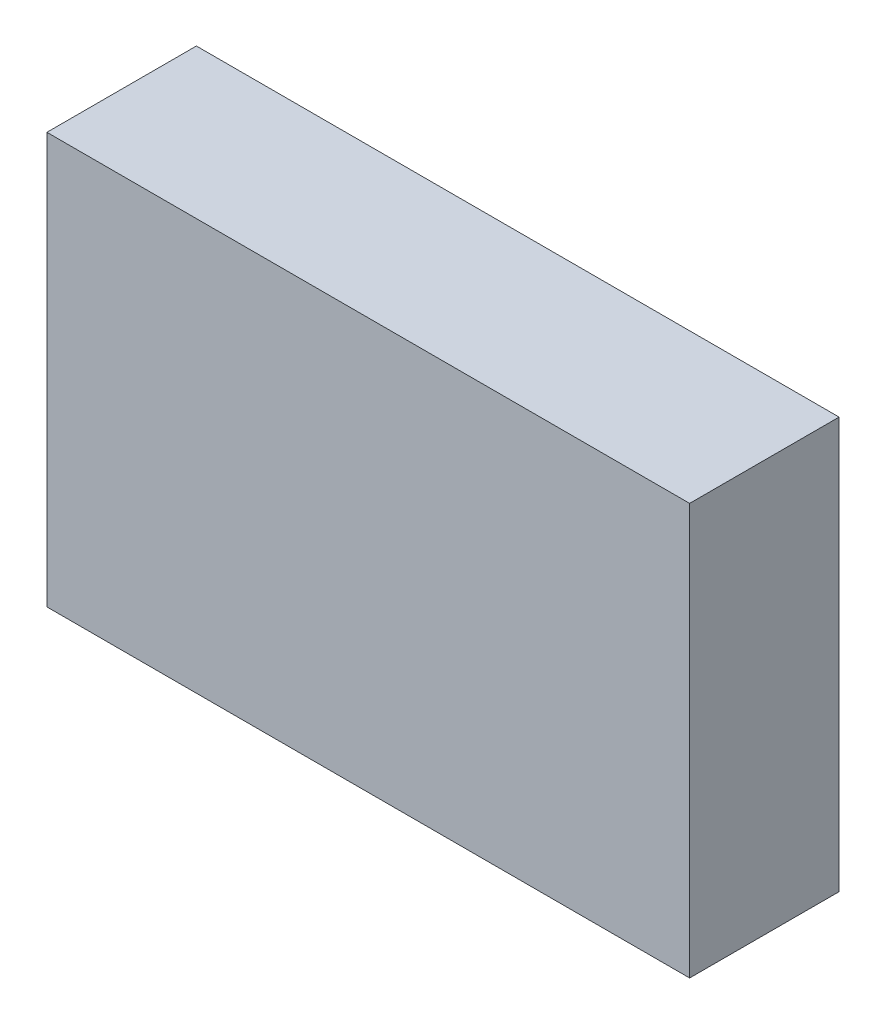
ISO-10303-21;
HEADER;
FILE_DESCRIPTION(('STEP AP214'),'2;1');
FILE_NAME('part.step','',(''),(''),'','','');
FILE_SCHEMA(('AUTOMOTIVE_DESIGN { 1 0 10303 214 1 1 1 1 }'));
ENDSEC;
DATA;
#1=APPLICATION_CONTEXT('core data for automotive mechanical design processes');
#2=APPLICATION_PROTOCOL_DEFINITION('international standard','automotive_design',2000,#1);
#3=PRODUCT_CONTEXT('',#1,'mechanical');
#4=PRODUCT('Part','Part','',(#3));
#5=PRODUCT_RELATED_PRODUCT_CATEGORY('part','',(#4));
#6=PRODUCT_DEFINITION_FORMATION('','',#4);
#7=PRODUCT_DEFINITION_CONTEXT('part definition',#1,'design');
#8=PRODUCT_DEFINITION('design','',#6,#7);
#9=PRODUCT_DEFINITION_SHAPE('','',#8);
#10=(LENGTH_UNIT() NAMED_UNIT(*) SI_UNIT(.MILLI.,.METRE.));
#11=(NAMED_UNIT(*) PLANE_ANGLE_UNIT() SI_UNIT($,.RADIAN.));
#12=(NAMED_UNIT(*) SI_UNIT($,.STERADIAN.) SOLID_ANGLE_UNIT());
#13=UNCERTAINTY_MEASURE_WITH_UNIT(LENGTH_MEASURE(1.E-05),#10,'distance_accuracy_value','');
#14=(GEOMETRIC_REPRESENTATION_CONTEXT(3) GLOBAL_UNCERTAINTY_ASSIGNED_CONTEXT((#13)) GLOBAL_UNIT_ASSIGNED_CONTEXT((#10,
#11,#12)) REPRESENTATION_CONTEXT('',''));
#15=CARTESIAN_POINT('',(0.,0.,0.));
#16=DIRECTION('',(0.,0.,1.));
#17=DIRECTION('',(1.,0.,0.));
#18=AXIS2_PLACEMENT_3D('',#15,#16,#17);
#19=CARTESIAN_POINT('',(0.,55.,0.));
#20=DIRECTION('',(1.,0.,0.));
#21=DIRECTION('',(0.,0.,-1.));
#22=AXIS2_PLACEMENT_3D('',#19,#20,#21);
#23=PLANE('',#22);
#24=DIRECTION('',(0.,0.,1.));
#25=VECTOR('',#24,1.);
#26=CARTESIAN_POINT('',(0.,0.,0.));
#27=LINE('',#26,#25);
#28=CARTESIAN_POINT('',(0.,0.,0.));
#29=VERTEX_POINT('',#28);
#30=CARTESIAN_POINT('',(0.,0.,20.));
#31=VERTEX_POINT('',#30);
#32=EDGE_CURVE('E96',#29,#31,#27,.T.);
#33=ORIENTED_EDGE('',*,*,#32,.T.);
#34=DIRECTION('',(0.,-1.,0.));
#35=VECTOR('',#34,1.);
#36=CARTESIAN_POINT('',(0.,55.,20.));
#37=LINE('',#36,#35);
#38=CARTESIAN_POINT('',(0.,55.,20.));
#39=VERTEX_POINT('',#38);
#40=EDGE_CURVE('E11',#39,#31,#37,.T.);
#41=ORIENTED_EDGE('',*,*,#40,.F.);
#42=DIRECTION('',(0.,0.,1.));
#43=VECTOR('',#42,1.);
#44=CARTESIAN_POINT('',(0.,55.,0.));
#45=LINE('',#44,#43);
#46=CARTESIAN_POINT('',(0.,55.,0.));
#47=VERTEX_POINT('',#46);
#48=EDGE_CURVE('E84',#47,#39,#45,.T.);
#49=ORIENTED_EDGE('',*,*,#48,.F.);
#50=DIRECTION('',(0.,-1.,0.));
#51=VECTOR('',#50,1.);
#52=CARTESIAN_POINT('',(0.,55.,0.));
#53=LINE('',#52,#51);
#54=EDGE_CURVE('E92',#47,#29,#53,.T.);
#55=ORIENTED_EDGE('',*,*,#54,.T.);
#56=EDGE_LOOP('',(#33,#41,#49,#55));
#57=FACE_BOUND('',#56,.T.);
#58=ADVANCED_FACE('F33',(#57),#23,.F.);
#59=CARTESIAN_POINT('',(0.,55.,20.));
#60=DIRECTION('',(0.,0.,-1.));
#61=DIRECTION('',(-1.,0.,0.));
#62=AXIS2_PLACEMENT_3D('',#59,#60,#61);
#63=PLANE('',#62);
#64=DIRECTION('',(1.,0.,0.));
#65=VECTOR('',#64,1.);
#66=CARTESIAN_POINT('',(0.,0.,20.));
#67=LINE('',#66,#65);
#68=CARTESIAN_POINT('',(86.,0.,20.));
#69=VERTEX_POINT('',#68);
#70=EDGE_CURVE('E88',#31,#69,#67,.T.);
#71=ORIENTED_EDGE('',*,*,#70,.T.);
#72=DIRECTION('',(0.,-1.,0.));
#73=VECTOR('',#72,1.);
#74=CARTESIAN_POINT('',(86.,55.,20.));
#75=LINE('',#74,#73);
#76=CARTESIAN_POINT('',(86.,55.,20.));
#77=VERTEX_POINT('',#76);
#78=EDGE_CURVE('E41',#77,#69,#75,.T.);
#79=ORIENTED_EDGE('',*,*,#78,.F.);
#80=DIRECTION('',(1.,0.,0.));
#81=VECTOR('',#80,1.);
#82=CARTESIAN_POINT('',(0.,55.,20.));
#83=LINE('',#82,#81);
#84=EDGE_CURVE('E79',#39,#77,#83,.T.);
#85=ORIENTED_EDGE('',*,*,#84,.F.);
#86=ORIENTED_EDGE('',*,*,#40,.T.);
#87=EDGE_LOOP('',(#71,#79,#85,#86));
#88=FACE_BOUND('',#87,.T.);
#89=ADVANCED_FACE('F87',(#88),#63,.F.);
#90=CARTESIAN_POINT('',(86.,55.,0.));
#91=DIRECTION('',(-1.,0.,0.));
#92=DIRECTION('',(0.,0.,1.));
#93=AXIS2_PLACEMENT_3D('',#90,#91,#92);
#94=PLANE('',#93);
#95=DIRECTION('',(0.,0.,-1.));
#96=VECTOR('',#95,1.);
#97=CARTESIAN_POINT('',(86.,0.,0.));
#98=LINE('',#97,#96);
#99=CARTESIAN_POINT('',(86.,0.,0.));
#100=VERTEX_POINT('',#99);
#101=EDGE_CURVE('E66',#69,#100,#98,.T.);
#102=ORIENTED_EDGE('',*,*,#101,.T.);
#103=DIRECTION('',(0.,-1.,0.));
#104=VECTOR('',#103,1.);
#105=CARTESIAN_POINT('',(86.,55.,0.));
#106=LINE('',#105,#104);
#107=CARTESIAN_POINT('',(86.,55.,0.));
#108=VERTEX_POINT('',#107);
#109=EDGE_CURVE('E89',#108,#100,#106,.T.);
#110=ORIENTED_EDGE('',*,*,#109,.F.);
#111=DIRECTION('',(0.,0.,-1.));
#112=VECTOR('',#111,1.);
#113=CARTESIAN_POINT('',(86.,55.,0.));
#114=LINE('',#113,#112);
#115=EDGE_CURVE('E82',#77,#108,#114,.T.);
#116=ORIENTED_EDGE('',*,*,#115,.F.);
#117=ORIENTED_EDGE('',*,*,#78,.T.);
#118=EDGE_LOOP('',(#102,#110,#116,#117));
#119=FACE_BOUND('',#118,.T.);
#120=ADVANCED_FACE('F90',(#119),#94,.F.);
#121=CARTESIAN_POINT('',(0.,55.,0.));
#122=DIRECTION('',(0.,0.,1.));
#123=DIRECTION('',(1.,0.,0.));
#124=AXIS2_PLACEMENT_3D('',#121,#122,#123);
#125=PLANE('',#124);
#126=DIRECTION('',(-1.,0.,0.));
#127=VECTOR('',#126,1.);
#128=CARTESIAN_POINT('',(0.,0.,0.));
#129=LINE('',#128,#127);
#130=EDGE_CURVE('E72',#100,#29,#129,.T.);
#131=ORIENTED_EDGE('',*,*,#130,.T.);
#132=ORIENTED_EDGE('',*,*,#54,.F.);
#133=DIRECTION('',(-1.,0.,0.));
#134=VECTOR('',#133,1.);
#135=CARTESIAN_POINT('',(0.,55.,0.));
#136=LINE('',#135,#134);
#137=EDGE_CURVE('E49',#108,#47,#136,.T.);
#138=ORIENTED_EDGE('',*,*,#137,.F.);
#139=ORIENTED_EDGE('',*,*,#109,.T.);
#140=EDGE_LOOP('',(#131,#132,#138,#139));
#141=FACE_BOUND('',#140,.T.);
#142=ADVANCED_FACE('F103',(#141),#125,.F.);
#143=CARTESIAN_POINT('',(0.,55.,0.));
#144=DIRECTION('',(0.,1.,0.));
#145=DIRECTION('',(0.,0.,1.));
#146=AXIS2_PLACEMENT_3D('',#143,#144,#145);
#147=PLANE('',#146);
#148=ORIENTED_EDGE('',*,*,#48,.T.);
#149=ORIENTED_EDGE('',*,*,#84,.T.);
#150=ORIENTED_EDGE('',*,*,#115,.T.);
#151=ORIENTED_EDGE('',*,*,#137,.T.);
#152=EDGE_LOOP('',(#148,#149,#150,#151));
#153=FACE_BOUND('',#152,.T.);
#154=ADVANCED_FACE('F80',(#153),#147,.T.);
#155=CARTESIAN_POINT('',(0.,0.,0.));
#156=DIRECTION('',(0.,1.,0.));
#157=DIRECTION('',(0.,0.,1.));
#158=AXIS2_PLACEMENT_3D('',#155,#156,#157);
#159=PLANE('',#158);
#160=ORIENTED_EDGE('',*,*,#32,.F.);
#161=ORIENTED_EDGE('',*,*,#130,.F.);
#162=ORIENTED_EDGE('',*,*,#101,.F.);
#163=ORIENTED_EDGE('',*,*,#70,.F.);
#164=EDGE_LOOP('',(#160,#161,#162,#163));
#165=FACE_BOUND('',#164,.T.);
#166=ADVANCED_FACE('F106',(#165),#159,.F.);
#167=CLOSED_SHELL('',(#58,#89,#120,#142,#154,#166));
#168=MANIFOLD_SOLID_BREP('B2',#167);
#169=ADVANCED_BREP_SHAPE_REPRESENTATION('',(#18,#168),#14);
#170=SHAPE_DEFINITION_REPRESENTATION(#9,#169);
ENDSEC;
END-ISO-10303-21;
